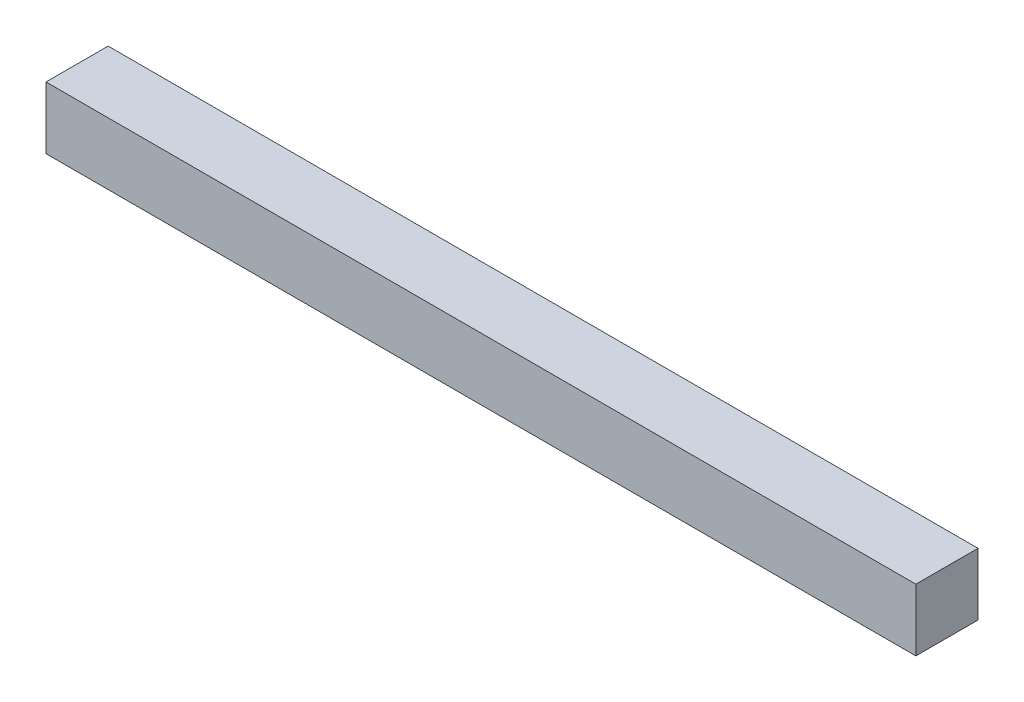
ISO-10303-21;
HEADER;
FILE_DESCRIPTION(('STEP AP214'),'2;1');
FILE_NAME('part.step','',(''),(''),'','','');
FILE_SCHEMA(('AUTOMOTIVE_DESIGN { 1 0 10303 214 1 1 1 1 }'));
ENDSEC;
DATA;
#1=APPLICATION_CONTEXT('core data for automotive mechanical design processes');
#2=APPLICATION_PROTOCOL_DEFINITION('international standard','automotive_design',2000,#1);
#3=PRODUCT_CONTEXT('',#1,'mechanical');
#4=PRODUCT('Part','Part','',(#3));
#5=PRODUCT_RELATED_PRODUCT_CATEGORY('part','',(#4));
#6=PRODUCT_DEFINITION_FORMATION('','',#4);
#7=PRODUCT_DEFINITION_CONTEXT('part definition',#1,'design');
#8=PRODUCT_DEFINITION('design','',#6,#7);
#9=PRODUCT_DEFINITION_SHAPE('','',#8);
#10=(LENGTH_UNIT() NAMED_UNIT(*) SI_UNIT(.MILLI.,.METRE.));
#11=(NAMED_UNIT(*) PLANE_ANGLE_UNIT() SI_UNIT($,.RADIAN.));
#12=(NAMED_UNIT(*) SI_UNIT($,.STERADIAN.) SOLID_ANGLE_UNIT());
#13=UNCERTAINTY_MEASURE_WITH_UNIT(LENGTH_MEASURE(1.E-05),#10,'distance_accuracy_value','');
#14=(GEOMETRIC_REPRESENTATION_CONTEXT(3) GLOBAL_UNCERTAINTY_ASSIGNED_CONTEXT((#13)) GLOBAL_UNIT_ASSIGNED_CONTEXT((#10,
#11,#12)) REPRESENTATION_CONTEXT('',''));
#15=CARTESIAN_POINT('',(0.,0.,0.));
#16=DIRECTION('',(0.,0.,1.));
#17=DIRECTION('',(1.,0.,0.));
#18=AXIS2_PLACEMENT_3D('',#15,#16,#17);
#19=CARTESIAN_POINT('',(44.45,6.35,3.175));
#20=DIRECTION('',(-1.,0.,0.));
#21=DIRECTION('',(0.,0.,1.));
#22=AXIS2_PLACEMENT_3D('',#19,#20,#21);
#23=PLANE('',#22);
#24=DIRECTION('',(0.,0.,-1.));
#25=VECTOR('',#24,1.);
#26=CARTESIAN_POINT('',(44.45,0.,3.175));
#27=LINE('',#26,#25);
#28=CARTESIAN_POINT('',(44.45,0.,3.175));
#29=VERTEX_POINT('',#28);
#30=CARTESIAN_POINT('',(44.45,0.,-3.175));
#31=VERTEX_POINT('',#30);
#32=EDGE_CURVE('E96',#29,#31,#27,.T.);
#33=ORIENTED_EDGE('',*,*,#32,.T.);
#34=DIRECTION('',(0.,-1.,0.));
#35=VECTOR('',#34,1.);
#36=CARTESIAN_POINT('',(44.45,6.35,-3.175));
#37=LINE('',#36,#35);
#38=CARTESIAN_POINT('',(44.45,6.35,-3.175));
#39=VERTEX_POINT('',#38);
#40=EDGE_CURVE('E11',#39,#31,#37,.T.);
#41=ORIENTED_EDGE('',*,*,#40,.F.);
#42=DIRECTION('',(0.,0.,-1.));
#43=VECTOR('',#42,1.);
#44=CARTESIAN_POINT('',(44.45,6.35,3.175));
#45=LINE('',#44,#43);
#46=CARTESIAN_POINT('',(44.45,6.35,3.175));
#47=VERTEX_POINT('',#46);
#48=EDGE_CURVE('E84',#47,#39,#45,.T.);
#49=ORIENTED_EDGE('',*,*,#48,.F.);
#50=DIRECTION('',(0.,-1.,0.));
#51=VECTOR('',#50,1.);
#52=CARTESIAN_POINT('',(44.45,6.35,3.175));
#53=LINE('',#52,#51);
#54=EDGE_CURVE('E92',#47,#29,#53,.T.);
#55=ORIENTED_EDGE('',*,*,#54,.T.);
#56=EDGE_LOOP('',(#33,#41,#49,#55));
#57=FACE_BOUND('',#56,.T.);
#58=ADVANCED_FACE('F33',(#57),#23,.F.);
#59=CARTESIAN_POINT('',(-44.45,6.35,-3.175));
#60=DIRECTION('',(0.,0.,1.));
#61=DIRECTION('',(1.,0.,0.));
#62=AXIS2_PLACEMENT_3D('',#59,#60,#61);
#63=PLANE('',#62);
#64=DIRECTION('',(-1.,0.,0.));
#65=VECTOR('',#64,1.);
#66=CARTESIAN_POINT('',(-44.45,0.,-3.175));
#67=LINE('',#66,#65);
#68=CARTESIAN_POINT('',(-44.45,0.,-3.175));
#69=VERTEX_POINT('',#68);
#70=EDGE_CURVE('E88',#31,#69,#67,.T.);
#71=ORIENTED_EDGE('',*,*,#70,.T.);
#72=DIRECTION('',(0.,-1.,0.));
#73=VECTOR('',#72,1.);
#74=CARTESIAN_POINT('',(-44.45,6.35,-3.175));
#75=LINE('',#74,#73);
#76=CARTESIAN_POINT('',(-44.45,6.35,-3.175));
#77=VERTEX_POINT('',#76);
#78=EDGE_CURVE('E41',#77,#69,#75,.T.);
#79=ORIENTED_EDGE('',*,*,#78,.F.);
#80=DIRECTION('',(-1.,0.,0.));
#81=VECTOR('',#80,1.);
#82=CARTESIAN_POINT('',(-44.45,6.35,-3.175));
#83=LINE('',#82,#81);
#84=EDGE_CURVE('E79',#39,#77,#83,.T.);
#85=ORIENTED_EDGE('',*,*,#84,.F.);
#86=ORIENTED_EDGE('',*,*,#40,.T.);
#87=EDGE_LOOP('',(#71,#79,#85,#86));
#88=FACE_BOUND('',#87,.T.);
#89=ADVANCED_FACE('F87',(#88),#63,.F.);
#90=CARTESIAN_POINT('',(-44.45,6.35,3.175));
#91=DIRECTION('',(1.,0.,0.));
#92=DIRECTION('',(0.,0.,-1.));
#93=AXIS2_PLACEMENT_3D('',#90,#91,#92);
#94=PLANE('',#93);
#95=DIRECTION('',(0.,0.,1.));
#96=VECTOR('',#95,1.);
#97=CARTESIAN_POINT('',(-44.45,0.,3.175));
#98=LINE('',#97,#96);
#99=CARTESIAN_POINT('',(-44.45,0.,3.175));
#100=VERTEX_POINT('',#99);
#101=EDGE_CURVE('E66',#69,#100,#98,.T.);
#102=ORIENTED_EDGE('',*,*,#101,.T.);
#103=DIRECTION('',(0.,-1.,0.));
#104=VECTOR('',#103,1.);
#105=CARTESIAN_POINT('',(-44.45,6.35,3.175));
#106=LINE('',#105,#104);
#107=CARTESIAN_POINT('',(-44.45,6.35,3.175));
#108=VERTEX_POINT('',#107);
#109=EDGE_CURVE('E89',#108,#100,#106,.T.);
#110=ORIENTED_EDGE('',*,*,#109,.F.);
#111=DIRECTION('',(0.,0.,1.));
#112=VECTOR('',#111,1.);
#113=CARTESIAN_POINT('',(-44.45,6.35,3.175));
#114=LINE('',#113,#112);
#115=EDGE_CURVE('E82',#77,#108,#114,.T.);
#116=ORIENTED_EDGE('',*,*,#115,.F.);
#117=ORIENTED_EDGE('',*,*,#78,.T.);
#118=EDGE_LOOP('',(#102,#110,#116,#117));
#119=FACE_BOUND('',#118,.T.);
#120=ADVANCED_FACE('F90',(#119),#94,.F.);
#121=CARTESIAN_POINT('',(-44.45,6.35,3.175));
#122=DIRECTION('',(0.,0.,-1.));
#123=DIRECTION('',(-1.,0.,0.));
#124=AXIS2_PLACEMENT_3D('',#121,#122,#123);
#125=PLANE('',#124);
#126=DIRECTION('',(1.,0.,0.));
#127=VECTOR('',#126,1.);
#128=CARTESIAN_POINT('',(-44.45,0.,3.175));
#129=LINE('',#128,#127);
#130=EDGE_CURVE('E72',#100,#29,#129,.T.);
#131=ORIENTED_EDGE('',*,*,#130,.T.);
#132=ORIENTED_EDGE('',*,*,#54,.F.);
#133=DIRECTION('',(1.,0.,0.));
#134=VECTOR('',#133,1.);
#135=CARTESIAN_POINT('',(-44.45,6.35,3.175));
#136=LINE('',#135,#134);
#137=EDGE_CURVE('E49',#108,#47,#136,.T.);
#138=ORIENTED_EDGE('',*,*,#137,.F.);
#139=ORIENTED_EDGE('',*,*,#109,.T.);
#140=EDGE_LOOP('',(#131,#132,#138,#139));
#141=FACE_BOUND('',#140,.T.);
#142=ADVANCED_FACE('F103',(#141),#125,.F.);
#143=CARTESIAN_POINT('',(0.,6.35,0.));
#144=DIRECTION('',(0.,-1.,0.));
#145=DIRECTION('',(0.,0.,-1.));
#146=AXIS2_PLACEMENT_3D('',#143,#144,#145);
#147=PLANE('',#146);
#148=ORIENTED_EDGE('',*,*,#48,.T.);
#149=ORIENTED_EDGE('',*,*,#84,.T.);
#150=ORIENTED_EDGE('',*,*,#115,.T.);
#151=ORIENTED_EDGE('',*,*,#137,.T.);
#152=EDGE_LOOP('',(#148,#149,#150,#151));
#153=FACE_BOUND('',#152,.T.);
#154=ADVANCED_FACE('F80',(#153),#147,.F.);
#155=CARTESIAN_POINT('',(0.,0.,0.));
#156=DIRECTION('',(0.,-1.,0.));
#157=DIRECTION('',(0.,0.,-1.));
#158=AXIS2_PLACEMENT_3D('',#155,#156,#157);
#159=PLANE('',#158);
#160=ORIENTED_EDGE('',*,*,#32,.F.);
#161=ORIENTED_EDGE('',*,*,#130,.F.);
#162=ORIENTED_EDGE('',*,*,#101,.F.);
#163=ORIENTED_EDGE('',*,*,#70,.F.);
#164=EDGE_LOOP('',(#160,#161,#162,#163));
#165=FACE_BOUND('',#164,.T.);
#166=ADVANCED_FACE('F106',(#165),#159,.T.);
#167=CLOSED_SHELL('',(#58,#89,#120,#142,#154,#166));
#168=MANIFOLD_SOLID_BREP('B2',#167);
#169=ADVANCED_BREP_SHAPE_REPRESENTATION('',(#18,#168),#14);
#170=SHAPE_DEFINITION_REPRESENTATION(#9,#169);
ENDSEC;
END-ISO-10303-21;
